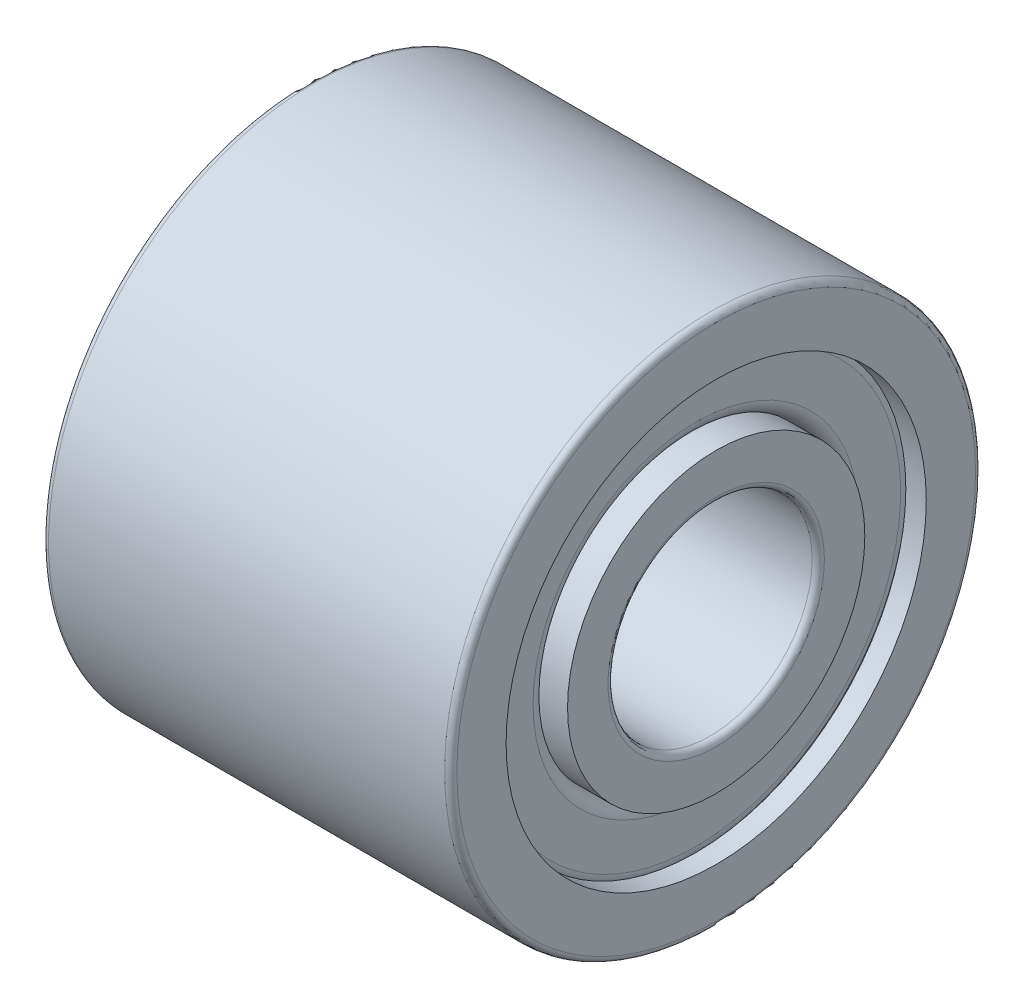
ISO-10303-21;
HEADER;
FILE_DESCRIPTION(('STEP AP214'),'2;1');
FILE_NAME('part.step','',(''),(''),'','','');
FILE_SCHEMA(('AUTOMOTIVE_DESIGN { 1 0 10303 214 1 1 1 1 }'));
ENDSEC;
DATA;
#1=APPLICATION_CONTEXT('core data for automotive mechanical design processes');
#2=APPLICATION_PROTOCOL_DEFINITION('international standard','automotive_design',2000,#1);
#3=PRODUCT_CONTEXT('',#1,'mechanical');
#4=PRODUCT('Part','Part','',(#3));
#5=PRODUCT_RELATED_PRODUCT_CATEGORY('part','',(#4));
#6=PRODUCT_DEFINITION_FORMATION('','',#4);
#7=PRODUCT_DEFINITION_CONTEXT('part definition',#1,'design');
#8=PRODUCT_DEFINITION('design','',#6,#7);
#9=PRODUCT_DEFINITION_SHAPE('','',#8);
#10=(LENGTH_UNIT() NAMED_UNIT(*) SI_UNIT(.MILLI.,.METRE.));
#11=(NAMED_UNIT(*) PLANE_ANGLE_UNIT() SI_UNIT($,.RADIAN.));
#12=(NAMED_UNIT(*) SI_UNIT($,.STERADIAN.) SOLID_ANGLE_UNIT());
#13=UNCERTAINTY_MEASURE_WITH_UNIT(LENGTH_MEASURE(1.E-05),#10,'distance_accuracy_value','');
#14=(GEOMETRIC_REPRESENTATION_CONTEXT(3) GLOBAL_UNCERTAINTY_ASSIGNED_CONTEXT((#13)) GLOBAL_UNIT_ASSIGNED_CONTEXT((#10,
#11,#12)) REPRESENTATION_CONTEXT('',''));
#15=CARTESIAN_POINT('',(0.,0.,0.));
#16=DIRECTION('',(0.,0.,1.));
#17=DIRECTION('',(1.,0.,0.));
#18=AXIS2_PLACEMENT_3D('',#15,#16,#17);
#19=CARTESIAN_POINT('',(-7.9375,0.,0.));
#20=DIRECTION('',(1.,0.,0.));
#21=DIRECTION('',(0.,0.,-1.));
#22=AXIS2_PLACEMENT_3D('',#19,#20,#21);
#23=CYLINDRICAL_SURFACE('',#22,5.36);
#24=CARTESIAN_POINT('',(-4.5,0.,0.));
#25=DIRECTION('',(1.,0.,0.));
#26=DIRECTION('',(0.,0.,-1.));
#27=AXIS2_PLACEMENT_3D('',#24,#25,#26);
#28=CIRCLE('',#27,5.36);
#29=CARTESIAN_POINT('',(-4.5,0.,-5.36));
#30=VERTEX_POINT('',#29);
#31=EDGE_CURVE('E10',#30,#30,#28,.T.);
#32=ORIENTED_EDGE('',*,*,#31,.F.);
#33=EDGE_LOOP('',(#32));
#34=FACE_BOUND('',#33,.T.);
#35=CARTESIAN_POINT('',(-4.18201831420968,0.,0.));
#36=DIRECTION('',(1.,0.,0.));
#37=DIRECTION('',(0.,0.,-1.));
#38=AXIS2_PLACEMENT_3D('',#35,#36,#37);
#39=CIRCLE('',#38,5.36);
#40=CARTESIAN_POINT('',(-4.18201831420968,0.,-5.36));
#41=VERTEX_POINT('',#40);
#42=EDGE_CURVE('E34',#41,#41,#39,.T.);
#43=ORIENTED_EDGE('',*,*,#42,.T.);
#44=EDGE_LOOP('',(#43));
#45=FACE_BOUND('',#44,.T.);
#46=ADVANCED_FACE('F31',(#34,#45),#23,.F.);
#47=CARTESIAN_POINT('',(4.5,0.,0.));
#48=DIRECTION('',(1.,0.,0.));
#49=DIRECTION('',(0.,0.,-1.));
#50=AXIS2_PLACEMENT_3D('',#47,#48,#49);
#51=CIRCLE('',#50,5.36);
#52=CARTESIAN_POINT('',(4.5,0.,-5.36));
#53=VERTEX_POINT('',#52);
#54=EDGE_CURVE('E52',#53,#53,#51,.T.);
#55=ORIENTED_EDGE('',*,*,#54,.T.);
#56=EDGE_LOOP('',(#55));
#57=FACE_BOUND('',#56,.T.);
#58=CARTESIAN_POINT('',(4.18201831420971,0.,0.));
#59=DIRECTION('',(-1.,0.,0.));
#60=DIRECTION('',(0.,0.,1.));
#61=AXIS2_PLACEMENT_3D('',#58,#59,#60);
#62=CIRCLE('',#61,5.36);
#63=CARTESIAN_POINT('',(4.18201831420971,0.,5.36));
#64=VERTEX_POINT('',#63);
#65=EDGE_CURVE('E46',#64,#64,#62,.T.);
#66=ORIENTED_EDGE('',*,*,#65,.T.);
#67=EDGE_LOOP('',(#66));
#68=FACE_BOUND('',#67,.T.);
#69=ADVANCED_FACE('F99',(#57,#68),#23,.F.);
#70=CARTESIAN_POINT('',(-4.5,5.36,0.));
#71=DIRECTION('',(1.,0.,0.));
#72=DIRECTION('',(0.,0.,-1.));
#73=AXIS2_PLACEMENT_3D('',#70,#71,#72);
#74=PLANE('',#73);
#75=ORIENTED_EDGE('',*,*,#31,.T.);
#76=EDGE_LOOP('',(#75));
#77=FACE_BOUND('',#76,.T.);
#78=CARTESIAN_POINT('',(-4.5,0.,0.));
#79=DIRECTION('',(1.,0.,0.));
#80=DIRECTION('',(0.,0.,-1.));
#81=AXIS2_PLACEMENT_3D('',#78,#79,#80);
#82=CIRCLE('',#81,5.145);
#83=CARTESIAN_POINT('',(-4.5,0.,-5.145));
#84=VERTEX_POINT('',#83);
#85=EDGE_CURVE('E38',#84,#84,#82,.T.);
#86=ORIENTED_EDGE('',*,*,#85,.F.);
#87=EDGE_LOOP('',(#86));
#88=FACE_BOUND('',#87,.T.);
#89=ADVANCED_FACE('F90',(#77,#88),#74,.T.);
#90=CARTESIAN_POINT('',(-7.9375,0.,0.));
#91=DIRECTION('',(1.,0.,0.));
#92=DIRECTION('',(0.,0.,-1.));
#93=AXIS2_PLACEMENT_3D('',#90,#91,#92);
#94=CYLINDRICAL_SURFACE('',#93,5.145);
#95=ORIENTED_EDGE('',*,*,#85,.T.);
#96=EDGE_LOOP('',(#95));
#97=FACE_BOUND('',#96,.T.);
#98=CARTESIAN_POINT('',(-5.,0.,0.));
#99=DIRECTION('',(1.,0.,0.));
#100=DIRECTION('',(0.,0.,-1.));
#101=AXIS2_PLACEMENT_3D('',#98,#99,#100);
#102=CIRCLE('',#101,5.145);
#103=CARTESIAN_POINT('',(-5.,0.,-5.145));
#104=VERTEX_POINT('',#103);
#105=EDGE_CURVE('E43',#104,#104,#102,.T.);
#106=ORIENTED_EDGE('',*,*,#105,.F.);
#107=EDGE_LOOP('',(#106));
#108=FACE_BOUND('',#107,.T.);
#109=ADVANCED_FACE('F88',(#97,#108),#94,.F.);
#110=CARTESIAN_POINT('',(-5.,5.145,0.));
#111=DIRECTION('',(-1.,0.,0.));
#112=DIRECTION('',(0.,0.,1.));
#113=AXIS2_PLACEMENT_3D('',#110,#111,#112);
#114=PLANE('',#113);
#115=ORIENTED_EDGE('',*,*,#105,.T.);
#116=EDGE_LOOP('',(#115));
#117=FACE_BOUND('',#116,.T.);
#118=CARTESIAN_POINT('',(-5.,0.,0.));
#119=DIRECTION('',(1.,0.,0.));
#120=DIRECTION('',(0.,0.,-1.));
#121=AXIS2_PLACEMENT_3D('',#118,#119,#120);
#122=CIRCLE('',#121,6.35);
#123=CARTESIAN_POINT('',(-5.,0.,-6.35));
#124=VERTEX_POINT('',#123);
#125=EDGE_CURVE('E80',#124,#124,#122,.T.);
#126=ORIENTED_EDGE('',*,*,#125,.F.);
#127=EDGE_LOOP('',(#126));
#128=FACE_BOUND('',#127,.T.);
#129=ADVANCED_FACE('F85',(#117,#128),#114,.T.);
#130=CARTESIAN_POINT('',(-4.85,0.,0.));
#131=DIRECTION('',(1.,0.,0.));
#132=DIRECTION('',(0.,0.,-1.));
#133=AXIS2_PLACEMENT_3D('',#130,#131,#132);
#134=TOROIDAL_SURFACE('',#133,6.35,0.15);
#135=ORIENTED_EDGE('',*,*,#125,.T.);
#136=EDGE_LOOP('',(#135));
#137=FACE_BOUND('',#136,.T.);
#138=CARTESIAN_POINT('',(-4.85,0.,0.));
#139=DIRECTION('',(1.,0.,0.));
#140=DIRECTION('',(0.,0.,-1.));
#141=AXIS2_PLACEMENT_3D('',#138,#139,#140);
#142=CIRCLE('',#141,6.5);
#143=CARTESIAN_POINT('',(-4.85,0.,-6.5));
#144=VERTEX_POINT('',#143);
#145=EDGE_CURVE('E77',#144,#144,#142,.T.);
#146=ORIENTED_EDGE('',*,*,#145,.F.);
#147=EDGE_LOOP('',(#146));
#148=FACE_BOUND('',#147,.T.);
#149=ADVANCED_FACE('F97',(#137,#148),#134,.T.);
#150=CARTESIAN_POINT('',(-7.9375,0.,0.));
#151=DIRECTION('',(1.,0.,0.));
#152=DIRECTION('',(0.,0.,-1.));
#153=AXIS2_PLACEMENT_3D('',#150,#151,#152);
#154=CYLINDRICAL_SURFACE('',#153,6.5);
#155=ORIENTED_EDGE('',*,*,#145,.T.);
#156=EDGE_LOOP('',(#155));
#157=FACE_BOUND('',#156,.T.);
#158=CARTESIAN_POINT('',(4.85,0.,0.));
#159=DIRECTION('',(1.,0.,0.));
#160=DIRECTION('',(0.,0.,-1.));
#161=AXIS2_PLACEMENT_3D('',#158,#159,#160);
#162=CIRCLE('',#161,6.5);
#163=CARTESIAN_POINT('',(4.85,0.,-6.5));
#164=VERTEX_POINT('',#163);
#165=EDGE_CURVE('E74',#164,#164,#162,.T.);
#166=ORIENTED_EDGE('',*,*,#165,.F.);
#167=EDGE_LOOP('',(#166));
#168=FACE_BOUND('',#167,.T.);
#169=ADVANCED_FACE('F137',(#157,#168),#154,.T.);
#170=CARTESIAN_POINT('',(4.85,0.,0.));
#171=DIRECTION('',(1.,0.,0.));
#172=DIRECTION('',(0.,0.,-1.));
#173=AXIS2_PLACEMENT_3D('',#170,#171,#172);
#174=TOROIDAL_SURFACE('',#173,6.35,0.15);
#175=ORIENTED_EDGE('',*,*,#165,.T.);
#176=EDGE_LOOP('',(#175));
#177=FACE_BOUND('',#176,.T.);
#178=CARTESIAN_POINT('',(5.,0.,0.));
#179=DIRECTION('',(1.,0.,0.));
#180=DIRECTION('',(0.,0.,-1.));
#181=AXIS2_PLACEMENT_3D('',#178,#179,#180);
#182=CIRCLE('',#181,6.35);
#183=CARTESIAN_POINT('',(5.,0.,-6.35));
#184=VERTEX_POINT('',#183);
#185=EDGE_CURVE('E71',#184,#184,#182,.T.);
#186=ORIENTED_EDGE('',*,*,#185,.F.);
#187=EDGE_LOOP('',(#186));
#188=FACE_BOUND('',#187,.T.);
#189=ADVANCED_FACE('F133',(#177,#188),#174,.T.);
#190=CARTESIAN_POINT('',(5.,6.35,0.));
#191=DIRECTION('',(1.,0.,0.));
#192=DIRECTION('',(0.,0.,-1.));
#193=AXIS2_PLACEMENT_3D('',#190,#191,#192);
#194=PLANE('',#193);
#195=ORIENTED_EDGE('',*,*,#185,.T.);
#196=EDGE_LOOP('',(#195));
#197=FACE_BOUND('',#196,.T.);
#198=CARTESIAN_POINT('',(5.,0.,0.));
#199=DIRECTION('',(1.,0.,0.));
#200=DIRECTION('',(0.,0.,-1.));
#201=AXIS2_PLACEMENT_3D('',#198,#199,#200);
#202=CIRCLE('',#201,5.145);
#203=CARTESIAN_POINT('',(5.,0.,-5.145));
#204=VERTEX_POINT('',#203);
#205=EDGE_CURVE('E68',#204,#204,#202,.T.);
#206=ORIENTED_EDGE('',*,*,#205,.F.);
#207=EDGE_LOOP('',(#206));
#208=FACE_BOUND('',#207,.T.);
#209=ADVANCED_FACE('F129',(#197,#208),#194,.T.);
#210=CARTESIAN_POINT('',(-7.9375,0.,0.));
#211=DIRECTION('',(1.,0.,0.));
#212=DIRECTION('',(0.,0.,-1.));
#213=AXIS2_PLACEMENT_3D('',#210,#211,#212);
#214=CYLINDRICAL_SURFACE('',#213,5.145);
#215=ORIENTED_EDGE('',*,*,#205,.T.);
#216=EDGE_LOOP('',(#215));
#217=FACE_BOUND('',#216,.T.);
#218=CARTESIAN_POINT('',(4.5,0.,0.));
#219=DIRECTION('',(1.,0.,0.));
#220=DIRECTION('',(0.,0.,-1.));
#221=AXIS2_PLACEMENT_3D('',#218,#219,#220);
#222=CIRCLE('',#221,5.145);
#223=CARTESIAN_POINT('',(4.5,0.,-5.145));
#224=VERTEX_POINT('',#223);
#225=EDGE_CURVE('E65',#224,#224,#222,.T.);
#226=ORIENTED_EDGE('',*,*,#225,.F.);
#227=EDGE_LOOP('',(#226));
#228=FACE_BOUND('',#227,.T.);
#229=ADVANCED_FACE('F122',(#217,#228),#214,.F.);
#230=CARTESIAN_POINT('',(4.5,5.145,0.));
#231=DIRECTION('',(-1.,0.,0.));
#232=DIRECTION('',(0.,0.,1.));
#233=AXIS2_PLACEMENT_3D('',#230,#231,#232);
#234=PLANE('',#233);
#235=ORIENTED_EDGE('',*,*,#225,.T.);
#236=EDGE_LOOP('',(#235));
#237=FACE_BOUND('',#236,.T.);
#238=ORIENTED_EDGE('',*,*,#54,.F.);
#239=EDGE_LOOP('',(#238));
#240=FACE_BOUND('',#239,.T.);
#241=ADVANCED_FACE('F113',(#237,#240),#234,.T.);
#242=CARTESIAN_POINT('',(-4.1558,0.,0.));
#243=DIRECTION('',(-1.,0.,0.));
#244=DIRECTION('',(0.,0.,1.));
#245=AXIS2_PLACEMENT_3D('',#242,#243,#244);
#246=TOROIDAL_SURFACE('',#245,5.0168,0.344199999999998);
#247=ORIENTED_EDGE('',*,*,#42,.F.);
#248=EDGE_LOOP('',(#247));
#249=FACE_BOUND('',#248,.T.);
#250=CARTESIAN_POINT('',(-4.5,0.,0.));
#251=DIRECTION('',(-1.,0.,0.));
#252=DIRECTION('',(0.,0.,1.));
#253=AXIS2_PLACEMENT_3D('',#250,#251,#252);
#254=CIRCLE('',#253,5.0168);
#255=CARTESIAN_POINT('',(-4.5,0.,5.0168));
#256=VERTEX_POINT('',#255);
#257=EDGE_CURVE('E48',#256,#256,#254,.T.);
#258=ORIENTED_EDGE('',*,*,#257,.F.);
#259=EDGE_LOOP('',(#258));
#260=FACE_BOUND('',#259,.T.);
#261=ADVANCED_FACE('F109',(#249,#260),#246,.T.);
#262=CARTESIAN_POINT('',(-4.5,5.0168,0.));
#263=DIRECTION('',(1.,0.,0.));
#264=DIRECTION('',(0.,0.,-1.));
#265=AXIS2_PLACEMENT_3D('',#262,#263,#264);
#266=PLANE('',#265);
#267=CARTESIAN_POINT('',(-4.5,0.,0.));
#268=DIRECTION('',(-1.,0.,0.));
#269=DIRECTION('',(0.,0.,1.));
#270=AXIS2_PLACEMENT_3D('',#267,#268,#269);
#271=CIRCLE('',#270,3.9842);
#272=CARTESIAN_POINT('',(-4.5,0.,3.9842));
#273=VERTEX_POINT('',#272);
#274=EDGE_CURVE('E54',#273,#273,#271,.T.);
#275=ORIENTED_EDGE('',*,*,#274,.F.);
#276=EDGE_LOOP('',(#275));
#277=FACE_BOUND('',#276,.T.);
#278=ORIENTED_EDGE('',*,*,#257,.T.);
#279=EDGE_LOOP('',(#278));
#280=FACE_BOUND('',#279,.T.);
#281=ADVANCED_FACE('F112',(#277,#280),#266,.F.);
#282=CARTESIAN_POINT('',(-4.1558,0.,0.));
#283=DIRECTION('',(-1.,0.,0.));
#284=DIRECTION('',(0.,0.,1.));
#285=AXIS2_PLACEMENT_3D('',#282,#283,#284);
#286=TOROIDAL_SURFACE('',#285,3.9842,0.344199999999999);
#287=CARTESIAN_POINT('',(-4.1558,0.,0.));
#288=DIRECTION('',(-1.,0.,0.));
#289=DIRECTION('',(0.,0.,1.));
#290=AXIS2_PLACEMENT_3D('',#287,#288,#289);
#291=CIRCLE('',#290,3.64);
#292=CARTESIAN_POINT('',(-4.1558,0.,3.64));
#293=VERTEX_POINT('',#292);
#294=EDGE_CURVE('E59',#293,#293,#291,.T.);
#295=ORIENTED_EDGE('',*,*,#294,.F.);
#296=EDGE_LOOP('',(#295));
#297=FACE_BOUND('',#296,.T.);
#298=ORIENTED_EDGE('',*,*,#274,.T.);
#299=EDGE_LOOP('',(#298));
#300=FACE_BOUND('',#299,.T.);
#301=ADVANCED_FACE('F119',(#297,#300),#286,.T.);
#302=CARTESIAN_POINT('',(4.1558,0.,0.));
#303=DIRECTION('',(-1.,0.,0.));
#304=DIRECTION('',(0.,0.,1.));
#305=AXIS2_PLACEMENT_3D('',#302,#303,#304);
#306=TOROIDAL_SURFACE('',#305,3.9842,0.3442);
#307=CARTESIAN_POINT('',(4.5,0.,0.));
#308=DIRECTION('',(-1.,0.,0.));
#309=DIRECTION('',(0.,0.,1.));
#310=AXIS2_PLACEMENT_3D('',#307,#308,#309);
#311=CIRCLE('',#310,3.9842);
#312=CARTESIAN_POINT('',(4.5,0.,3.9842));
#313=VERTEX_POINT('',#312);
#314=EDGE_CURVE('E340',#313,#313,#311,.T.);
#315=ORIENTED_EDGE('',*,*,#314,.F.);
#316=EDGE_LOOP('',(#315));
#317=FACE_BOUND('',#316,.T.);
#318=CARTESIAN_POINT('',(4.1558,0.,0.));
#319=DIRECTION('',(1.,0.,0.));
#320=DIRECTION('',(0.,0.,-1.));
#321=AXIS2_PLACEMENT_3D('',#318,#319,#320);
#322=CIRCLE('',#321,3.64);
#323=CARTESIAN_POINT('',(4.1558,0.,-3.64));
#324=VERTEX_POINT('',#323);
#325=EDGE_CURVE('E334',#324,#324,#322,.T.);
#326=ORIENTED_EDGE('',*,*,#325,.F.);
#327=EDGE_LOOP('',(#326));
#328=FACE_BOUND('',#327,.T.);
#329=ADVANCED_FACE('F210',(#317,#328),#306,.T.);
#330=CARTESIAN_POINT('',(4.5,3.9842,0.));
#331=DIRECTION('',(-1.,0.,0.));
#332=DIRECTION('',(0.,0.,1.));
#333=AXIS2_PLACEMENT_3D('',#330,#331,#332);
#334=PLANE('',#333);
#335=CARTESIAN_POINT('',(4.5,0.,0.));
#336=DIRECTION('',(-1.,0.,0.));
#337=DIRECTION('',(0.,0.,1.));
#338=AXIS2_PLACEMENT_3D('',#335,#336,#337);
#339=CIRCLE('',#338,5.0168);
#340=CARTESIAN_POINT('',(4.5,0.,5.0168));
#341=VERTEX_POINT('',#340);
#342=EDGE_CURVE('E337',#341,#341,#339,.T.);
#343=ORIENTED_EDGE('',*,*,#342,.F.);
#344=EDGE_LOOP('',(#343));
#345=FACE_BOUND('',#344,.T.);
#346=ORIENTED_EDGE('',*,*,#314,.T.);
#347=EDGE_LOOP('',(#346));
#348=FACE_BOUND('',#347,.T.);
#349=ADVANCED_FACE('F219',(#345,#348),#334,.F.);
#350=CARTESIAN_POINT('',(4.1558,0.,0.));
#351=DIRECTION('',(-1.,0.,0.));
#352=DIRECTION('',(0.,0.,1.));
#353=AXIS2_PLACEMENT_3D('',#350,#351,#352);
#354=TOROIDAL_SURFACE('',#353,5.0168,0.344199999999999);
#355=ORIENTED_EDGE('',*,*,#65,.F.);
#356=EDGE_LOOP('',(#355));
#357=FACE_BOUND('',#356,.T.);
#358=ORIENTED_EDGE('',*,*,#342,.T.);
#359=EDGE_LOOP('',(#358));
#360=FACE_BOUND('',#359,.T.);
#361=ADVANCED_FACE('F229',(#357,#360),#354,.T.);
#362=CARTESIAN_POINT('',(-7.9375,0.,0.));
#363=DIRECTION('',(1.,0.,0.));
#364=DIRECTION('',(0.,0.,-1.));
#365=AXIS2_PLACEMENT_3D('',#362,#363,#364);
#366=CYLINDRICAL_SURFACE('',#365,3.64);
#367=CARTESIAN_POINT('',(-5.,0.,0.));
#368=DIRECTION('',(1.,0.,0.));
#369=DIRECTION('',(0.,0.,-1.));
#370=AXIS2_PLACEMENT_3D('',#367,#368,#369);
#371=CIRCLE('',#370,3.64);
#372=CARTESIAN_POINT('',(-5.,0.,-3.64));
#373=VERTEX_POINT('',#372);
#374=EDGE_CURVE('E331',#373,#373,#371,.T.);
#375=ORIENTED_EDGE('',*,*,#374,.T.);
#376=EDGE_LOOP('',(#375));
#377=FACE_BOUND('',#376,.T.);
#378=ORIENTED_EDGE('',*,*,#294,.T.);
#379=EDGE_LOOP('',(#378));
#380=FACE_BOUND('',#379,.T.);
#381=ADVANCED_FACE('F239',(#377,#380),#366,.T.);
#382=ORIENTED_EDGE('',*,*,#325,.T.);
#383=EDGE_LOOP('',(#382));
#384=FACE_BOUND('',#383,.T.);
#385=CARTESIAN_POINT('',(5.,0.,0.));
#386=DIRECTION('',(1.,0.,0.));
#387=DIRECTION('',(0.,0.,-1.));
#388=AXIS2_PLACEMENT_3D('',#385,#386,#387);
#389=CIRCLE('',#388,3.64);
#390=CARTESIAN_POINT('',(5.,0.,-3.64));
#391=VERTEX_POINT('',#390);
#392=EDGE_CURVE('E315',#391,#391,#389,.T.);
#393=ORIENTED_EDGE('',*,*,#392,.F.);
#394=EDGE_LOOP('',(#393));
#395=FACE_BOUND('',#394,.T.);
#396=ADVANCED_FACE('F249',(#384,#395),#366,.T.);
#397=CARTESIAN_POINT('',(-5.,3.64,0.));
#398=DIRECTION('',(-1.,0.,0.));
#399=DIRECTION('',(0.,0.,1.));
#400=AXIS2_PLACEMENT_3D('',#397,#398,#399);
#401=PLANE('',#400);
#402=CARTESIAN_POINT('',(-5.,0.,0.));
#403=DIRECTION('',(1.,0.,0.));
#404=DIRECTION('',(0.,0.,-1.));
#405=AXIS2_PLACEMENT_3D('',#402,#403,#404);
#406=CIRCLE('',#405,2.65);
#407=CARTESIAN_POINT('',(-5.,0.,-2.65));
#408=VERTEX_POINT('',#407);
#409=EDGE_CURVE('E328',#408,#408,#406,.T.);
#410=ORIENTED_EDGE('',*,*,#409,.T.);
#411=EDGE_LOOP('',(#410));
#412=FACE_BOUND('',#411,.T.);
#413=ORIENTED_EDGE('',*,*,#374,.F.);
#414=EDGE_LOOP('',(#413));
#415=FACE_BOUND('',#414,.T.);
#416=ADVANCED_FACE('F259',(#412,#415),#401,.T.);
#417=CARTESIAN_POINT('',(-4.85,0.,0.));
#418=DIRECTION('',(1.,0.,0.));
#419=DIRECTION('',(0.,0.,-1.));
#420=AXIS2_PLACEMENT_3D('',#417,#418,#419);
#421=TOROIDAL_SURFACE('',#420,2.65,0.15);
#422=CARTESIAN_POINT('',(-4.85,0.,0.));
#423=DIRECTION('',(1.,0.,0.));
#424=DIRECTION('',(0.,0.,-1.));
#425=AXIS2_PLACEMENT_3D('',#422,#423,#424);
#426=CIRCLE('',#425,2.5);
#427=CARTESIAN_POINT('',(-4.85,0.,-2.5));
#428=VERTEX_POINT('',#427);
#429=EDGE_CURVE('E322',#428,#428,#426,.T.);
#430=ORIENTED_EDGE('',*,*,#429,.T.);
#431=EDGE_LOOP('',(#430));
#432=FACE_BOUND('',#431,.T.);
#433=ORIENTED_EDGE('',*,*,#409,.F.);
#434=EDGE_LOOP('',(#433));
#435=FACE_BOUND('',#434,.T.);
#436=ADVANCED_FACE('F268',(#432,#435),#421,.T.);
#437=CARTESIAN_POINT('',(-7.9375,0.,0.));
#438=DIRECTION('',(1.,0.,0.));
#439=DIRECTION('',(0.,0.,-1.));
#440=AXIS2_PLACEMENT_3D('',#437,#438,#439);
#441=CYLINDRICAL_SURFACE('',#440,2.5);
#442=CARTESIAN_POINT('',(4.85,0.,0.));
#443=DIRECTION('',(1.,0.,0.));
#444=DIRECTION('',(0.,0.,-1.));
#445=AXIS2_PLACEMENT_3D('',#442,#443,#444);
#446=CIRCLE('',#445,2.5);
#447=CARTESIAN_POINT('',(4.85,0.,-2.5));
#448=VERTEX_POINT('',#447);
#449=EDGE_CURVE('E319',#448,#448,#446,.T.);
#450=ORIENTED_EDGE('',*,*,#449,.T.);
#451=EDGE_LOOP('',(#450));
#452=FACE_BOUND('',#451,.T.);
#453=ORIENTED_EDGE('',*,*,#429,.F.);
#454=EDGE_LOOP('',(#453));
#455=FACE_BOUND('',#454,.T.);
#456=ADVANCED_FACE('F278',(#452,#455),#441,.F.);
#457=CARTESIAN_POINT('',(4.85,0.,0.));
#458=DIRECTION('',(1.,0.,0.));
#459=DIRECTION('',(0.,0.,-1.));
#460=AXIS2_PLACEMENT_3D('',#457,#458,#459);
#461=TOROIDAL_SURFACE('',#460,2.65,0.15);
#462=CARTESIAN_POINT('',(5.,0.,0.));
#463=DIRECTION('',(1.,0.,0.));
#464=DIRECTION('',(0.,0.,-1.));
#465=AXIS2_PLACEMENT_3D('',#462,#463,#464);
#466=CIRCLE('',#465,2.65);
#467=CARTESIAN_POINT('',(5.,0.,-2.65));
#468=VERTEX_POINT('',#467);
#469=EDGE_CURVE('E318',#468,#468,#466,.T.);
#470=ORIENTED_EDGE('',*,*,#469,.T.);
#471=EDGE_LOOP('',(#470));
#472=FACE_BOUND('',#471,.T.);
#473=ORIENTED_EDGE('',*,*,#449,.F.);
#474=EDGE_LOOP('',(#473));
#475=FACE_BOUND('',#474,.T.);
#476=ADVANCED_FACE('F288',(#472,#475),#461,.T.);
#477=CARTESIAN_POINT('',(5.,2.65,0.));
#478=DIRECTION('',(1.,0.,0.));
#479=DIRECTION('',(0.,0.,-1.));
#480=AXIS2_PLACEMENT_3D('',#477,#478,#479);
#481=PLANE('',#480);
#482=ORIENTED_EDGE('',*,*,#392,.T.);
#483=EDGE_LOOP('',(#482));
#484=FACE_BOUND('',#483,.T.);
#485=ORIENTED_EDGE('',*,*,#469,.F.);
#486=EDGE_LOOP('',(#485));
#487=FACE_BOUND('',#486,.T.);
#488=ADVANCED_FACE('F298',(#484,#487),#481,.T.);
#489=CLOSED_SHELL('',(#46,#69,#89,#109,#129,#149,#169,#189,#209,#229,#241,#261,#281,#301,#329,
#349,#361,#381,#396,#416,#436,#456,#476,#488));
#490=MANIFOLD_SOLID_BREP('B2',#489);
#491=ADVANCED_BREP_SHAPE_REPRESENTATION('',(#18,#490),#14);
#492=SHAPE_DEFINITION_REPRESENTATION(#9,#491);
ENDSEC;
END-ISO-10303-21;
